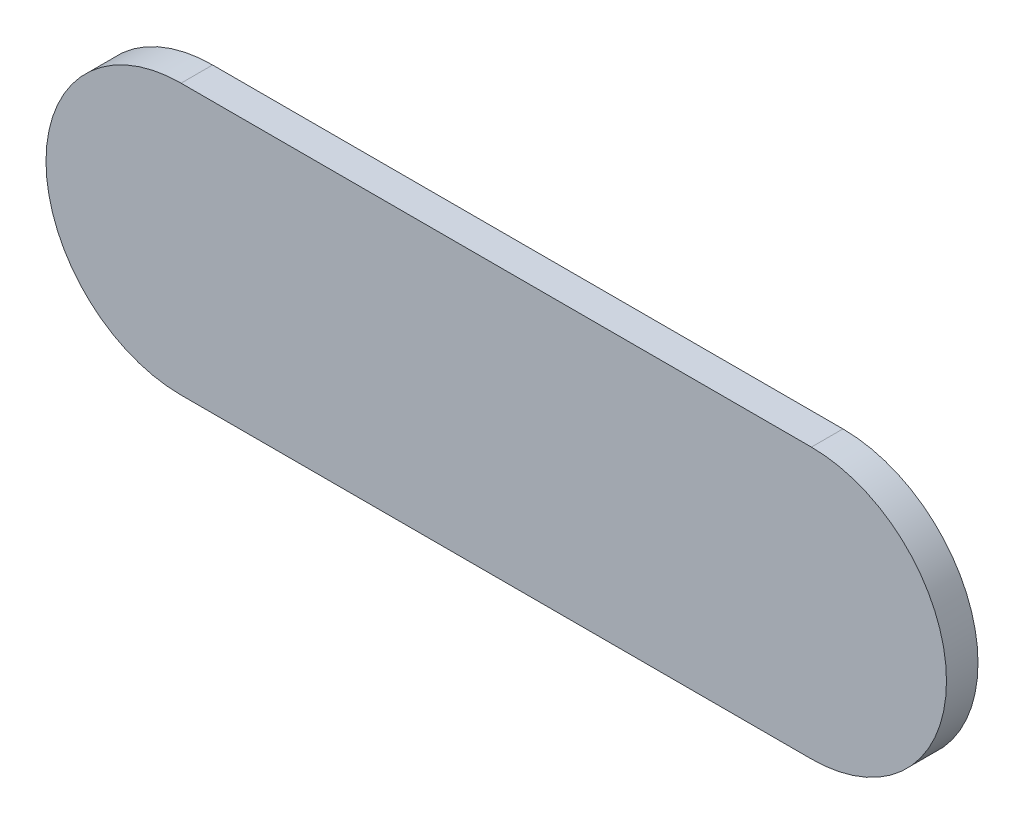
ISO-10303-21;
HEADER;
FILE_DESCRIPTION(('STEP AP214'),'2;1');
FILE_NAME('part.step','',(''),(''),'','','');
FILE_SCHEMA(('AUTOMOTIVE_DESIGN { 1 0 10303 214 1 1 1 1 }'));
ENDSEC;
DATA;
#1=APPLICATION_CONTEXT('core data for automotive mechanical design processes');
#2=APPLICATION_PROTOCOL_DEFINITION('international standard','automotive_design',2000,#1);
#3=PRODUCT_CONTEXT('',#1,'mechanical');
#4=PRODUCT('Part','Part','',(#3));
#5=PRODUCT_RELATED_PRODUCT_CATEGORY('part','',(#4));
#6=PRODUCT_DEFINITION_FORMATION('','',#4);
#7=PRODUCT_DEFINITION_CONTEXT('part definition',#1,'design');
#8=PRODUCT_DEFINITION('design','',#6,#7);
#9=PRODUCT_DEFINITION_SHAPE('','',#8);
#10=(LENGTH_UNIT() NAMED_UNIT(*) SI_UNIT(.MILLI.,.METRE.));
#11=(NAMED_UNIT(*) PLANE_ANGLE_UNIT() SI_UNIT($,.RADIAN.));
#12=(NAMED_UNIT(*) SI_UNIT($,.STERADIAN.) SOLID_ANGLE_UNIT());
#13=UNCERTAINTY_MEASURE_WITH_UNIT(LENGTH_MEASURE(1.E-05),#10,'distance_accuracy_value','');
#14=(GEOMETRIC_REPRESENTATION_CONTEXT(3) GLOBAL_UNCERTAINTY_ASSIGNED_CONTEXT((#13)) GLOBAL_UNIT_ASSIGNED_CONTEXT((#10,
#11,#12)) REPRESENTATION_CONTEXT('',''));
#15=CARTESIAN_POINT('',(0.,0.,0.));
#16=DIRECTION('',(0.,0.,1.));
#17=DIRECTION('',(1.,0.,0.));
#18=AXIS2_PLACEMENT_3D('',#15,#16,#17);
#19=CARTESIAN_POINT('',(133.818,-117.704,1.635));
#20=DIRECTION('',(0.,0.,1.));
#21=DIRECTION('',(1.,0.,0.));
#22=AXIS2_PLACEMENT_3D('',#19,#20,#21);
#23=PLANE('',#22);
#24=DIRECTION('',(1.,0.,0.));
#25=VECTOR('',#24,1.);
#26=CARTESIAN_POINT('',(133.818,-117.704,1.635));
#27=LINE('',#26,#25);
#28=CARTESIAN_POINT('',(133.818,-117.704,1.635));
#29=VERTEX_POINT('',#28);
#30=CARTESIAN_POINT('',(134.518,-117.704,1.635));
#31=VERTEX_POINT('',#30);
#32=EDGE_CURVE('E83',#29,#31,#27,.T.);
#33=ORIENTED_EDGE('',*,*,#32,.T.);
#34=CARTESIAN_POINT('',(134.518,-117.554,1.635));
#35=DIRECTION('',(0.,0.,1.));
#36=DIRECTION('',(-1.894780628694E-13,-1.,0.));
#37=AXIS2_PLACEMENT_3D('',#34,#35,#36);
#38=CIRCLE('',#37,0.15);
#39=CARTESIAN_POINT('',(134.518,-117.404,1.635));
#40=VERTEX_POINT('',#39);
#41=EDGE_CURVE('E107',#31,#40,#38,.T.);
#42=ORIENTED_EDGE('',*,*,#41,.T.);
#43=DIRECTION('',(-1.,0.,0.));
#44=VECTOR('',#43,1.);
#45=CARTESIAN_POINT('',(134.518,-117.404,1.635));
#46=LINE('',#45,#44);
#47=CARTESIAN_POINT('',(133.818,-117.404,1.635));
#48=VERTEX_POINT('',#47);
#49=EDGE_CURVE('E20',#40,#48,#46,.T.);
#50=ORIENTED_EDGE('',*,*,#49,.T.);
#51=CARTESIAN_POINT('',(133.818,-117.554,1.635));
#52=DIRECTION('',(0.,0.,1.));
#53=DIRECTION('',(1.894780628694E-13,1.,0.));
#54=AXIS2_PLACEMENT_3D('',#51,#52,#53);
#55=CIRCLE('',#54,0.15);
#56=EDGE_CURVE('E11',#48,#29,#55,.T.);
#57=ORIENTED_EDGE('',*,*,#56,.T.);
#58=EDGE_LOOP('',(#33,#42,#50,#57));
#59=FACE_BOUND('',#58,.T.);
#60=ADVANCED_FACE('F17',(#59),#23,.T.);
#61=CARTESIAN_POINT('',(133.818,-117.704,1.6));
#62=DIRECTION('',(0.,0.,1.));
#63=DIRECTION('',(1.,0.,0.));
#64=AXIS2_PLACEMENT_3D('',#61,#62,#63);
#65=PLANE('',#64);
#66=CARTESIAN_POINT('',(133.818,-117.554,1.6));
#67=DIRECTION('',(0.,0.,1.));
#68=DIRECTION('',(1.894780628694E-13,1.,0.));
#69=AXIS2_PLACEMENT_3D('',#66,#67,#68);
#70=CIRCLE('',#69,0.15);
#71=CARTESIAN_POINT('',(133.818,-117.404,1.6));
#72=VERTEX_POINT('',#71);
#73=CARTESIAN_POINT('',(133.818,-117.704,1.6));
#74=VERTEX_POINT('',#73);
#75=EDGE_CURVE('E26',#72,#74,#70,.T.);
#76=ORIENTED_EDGE('',*,*,#75,.F.);
#77=DIRECTION('',(-1.,0.,0.));
#78=VECTOR('',#77,1.);
#79=CARTESIAN_POINT('',(134.518,-117.404,1.6));
#80=LINE('',#79,#78);
#81=CARTESIAN_POINT('',(134.518,-117.404,1.6));
#82=VERTEX_POINT('',#81);
#83=EDGE_CURVE('E103',#82,#72,#80,.T.);
#84=ORIENTED_EDGE('',*,*,#83,.F.);
#85=CARTESIAN_POINT('',(134.518,-117.554,1.6));
#86=DIRECTION('',(0.,0.,1.));
#87=DIRECTION('',(-1.894780628694E-13,-1.,0.));
#88=AXIS2_PLACEMENT_3D('',#85,#86,#87);
#89=CIRCLE('',#88,0.15);
#90=CARTESIAN_POINT('',(134.518,-117.704,1.6));
#91=VERTEX_POINT('',#90);
#92=EDGE_CURVE('E85',#91,#82,#89,.T.);
#93=ORIENTED_EDGE('',*,*,#92,.F.);
#94=DIRECTION('',(1.,0.,0.));
#95=VECTOR('',#94,1.);
#96=CARTESIAN_POINT('',(133.818,-117.704,1.6));
#97=LINE('',#96,#95);
#98=EDGE_CURVE('E81',#74,#91,#97,.T.);
#99=ORIENTED_EDGE('',*,*,#98,.F.);
#100=EDGE_LOOP('',(#76,#84,#93,#99));
#101=FACE_BOUND('',#100,.T.);
#102=ADVANCED_FACE('F87',(#101),#65,.F.);
#103=CARTESIAN_POINT('',(133.818,-117.554,1.6));
#104=DIRECTION('',(0.,0.,-1.));
#105=DIRECTION('',(1.894780628694E-13,1.,0.));
#106=AXIS2_PLACEMENT_3D('',#103,#104,#105);
#107=CYLINDRICAL_SURFACE('',#106,0.15);
#108=ORIENTED_EDGE('',*,*,#75,.T.);
#109=DIRECTION('',(0.,0.,1.));
#110=VECTOR('',#109,1.);
#111=CARTESIAN_POINT('',(133.818,-117.704,1.6));
#112=LINE('',#111,#110);
#113=EDGE_CURVE('E70',#74,#29,#112,.T.);
#114=ORIENTED_EDGE('',*,*,#113,.T.);
#115=ORIENTED_EDGE('',*,*,#56,.F.);
#116=DIRECTION('',(0.,0.,1.));
#117=VECTOR('',#116,1.);
#118=CARTESIAN_POINT('',(133.818,-117.404,1.6));
#119=LINE('',#118,#117);
#120=EDGE_CURVE('E73',#72,#48,#119,.T.);
#121=ORIENTED_EDGE('',*,*,#120,.F.);
#122=EDGE_LOOP('',(#108,#114,#115,#121));
#123=FACE_BOUND('',#122,.T.);
#124=ADVANCED_FACE('F69',(#123),#107,.T.);
#125=CARTESIAN_POINT('',(134.518,-117.404,1.6));
#126=DIRECTION('',(0.,-1.,0.));
#127=DIRECTION('',(0.,0.,-1.));
#128=AXIS2_PLACEMENT_3D('',#125,#126,#127);
#129=PLANE('',#128);
#130=ORIENTED_EDGE('',*,*,#83,.T.);
#131=ORIENTED_EDGE('',*,*,#120,.T.);
#132=ORIENTED_EDGE('',*,*,#49,.F.);
#133=DIRECTION('',(0.,0.,1.));
#134=VECTOR('',#133,1.);
#135=CARTESIAN_POINT('',(134.518,-117.404,1.6));
#136=LINE('',#135,#134);
#137=EDGE_CURVE('E106',#82,#40,#136,.T.);
#138=ORIENTED_EDGE('',*,*,#137,.F.);
#139=EDGE_LOOP('',(#130,#131,#132,#138));
#140=FACE_BOUND('',#139,.T.);
#141=ADVANCED_FACE('F118',(#140),#129,.F.);
#142=CARTESIAN_POINT('',(134.518,-117.554,1.6));
#143=DIRECTION('',(0.,0.,-1.));
#144=DIRECTION('',(-1.894780628694E-13,-1.,0.));
#145=AXIS2_PLACEMENT_3D('',#142,#143,#144);
#146=CYLINDRICAL_SURFACE('',#145,0.15);
#147=ORIENTED_EDGE('',*,*,#92,.T.);
#148=ORIENTED_EDGE('',*,*,#137,.T.);
#149=ORIENTED_EDGE('',*,*,#41,.F.);
#150=DIRECTION('',(0.,0.,1.));
#151=VECTOR('',#150,1.);
#152=CARTESIAN_POINT('',(134.518,-117.704,1.6));
#153=LINE('',#152,#151);
#154=EDGE_CURVE('E91',#91,#31,#153,.T.);
#155=ORIENTED_EDGE('',*,*,#154,.F.);
#156=EDGE_LOOP('',(#147,#148,#149,#155));
#157=FACE_BOUND('',#156,.T.);
#158=ADVANCED_FACE('F120',(#157),#146,.T.);
#159=CARTESIAN_POINT('',(133.818,-117.704,1.6));
#160=DIRECTION('',(0.,1.,0.));
#161=DIRECTION('',(1.,0.,0.));
#162=AXIS2_PLACEMENT_3D('',#159,#160,#161);
#163=PLANE('',#162);
#164=ORIENTED_EDGE('',*,*,#98,.T.);
#165=ORIENTED_EDGE('',*,*,#154,.T.);
#166=ORIENTED_EDGE('',*,*,#32,.F.);
#167=ORIENTED_EDGE('',*,*,#113,.F.);
#168=EDGE_LOOP('',(#164,#165,#166,#167));
#169=FACE_BOUND('',#168,.T.);
#170=ADVANCED_FACE('F79',(#169),#163,.F.);
#171=CLOSED_SHELL('',(#60,#102,#124,#141,#158,#170));
#172=MANIFOLD_SOLID_BREP('B1',#171);
#173=ADVANCED_BREP_SHAPE_REPRESENTATION('',(#18,#172),#14);
#174=SHAPE_DEFINITION_REPRESENTATION(#9,#173);
ENDSEC;
END-ISO-10303-21;
